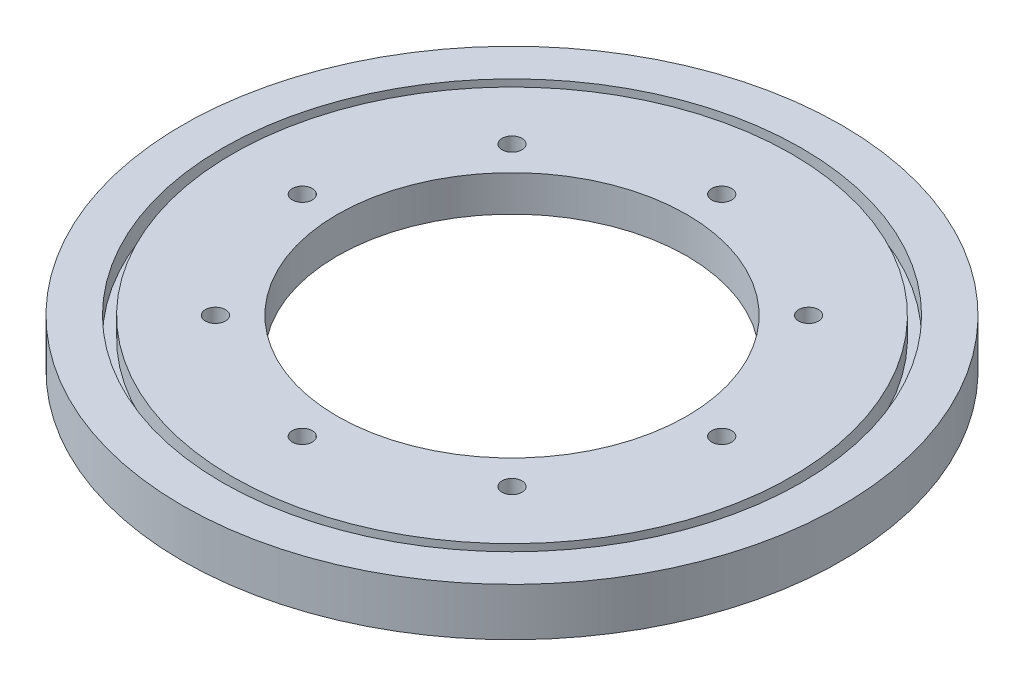
ISO-10303-21;
HEADER;
FILE_DESCRIPTION(('STEP AP214'),'2;1');
FILE_NAME('part.step','',(''),(''),'','','');
FILE_SCHEMA(('AUTOMOTIVE_DESIGN { 1 0 10303 214 1 1 1 1 }'));
ENDSEC;
DATA;
#1=APPLICATION_CONTEXT('core data for automotive mechanical design processes');
#2=APPLICATION_PROTOCOL_DEFINITION('international standard','automotive_design',2000,#1);
#3=PRODUCT_CONTEXT('',#1,'mechanical');
#4=PRODUCT('Part','Part','',(#3));
#5=PRODUCT_RELATED_PRODUCT_CATEGORY('part','',(#4));
#6=PRODUCT_DEFINITION_FORMATION('','',#4);
#7=PRODUCT_DEFINITION_CONTEXT('part definition',#1,'design');
#8=PRODUCT_DEFINITION('design','',#6,#7);
#9=PRODUCT_DEFINITION_SHAPE('','',#8);
#10=(LENGTH_UNIT() NAMED_UNIT(*) SI_UNIT(.MILLI.,.METRE.));
#11=(NAMED_UNIT(*) PLANE_ANGLE_UNIT() SI_UNIT($,.RADIAN.));
#12=(NAMED_UNIT(*) SI_UNIT($,.STERADIAN.) SOLID_ANGLE_UNIT());
#13=UNCERTAINTY_MEASURE_WITH_UNIT(LENGTH_MEASURE(1.E-05),#10,'distance_accuracy_value','');
#14=(GEOMETRIC_REPRESENTATION_CONTEXT(3) GLOBAL_UNCERTAINTY_ASSIGNED_CONTEXT((#13)) GLOBAL_UNIT_ASSIGNED_CONTEXT((#10,
#11,#12)) REPRESENTATION_CONTEXT('',''));
#15=CARTESIAN_POINT('',(0.,0.,0.));
#16=DIRECTION('',(0.,0.,1.));
#17=DIRECTION('',(1.,0.,0.));
#18=AXIS2_PLACEMENT_3D('',#15,#16,#17);
#19=CARTESIAN_POINT('',(0.,0.,0.));
#20=DIRECTION('',(0.,1.,0.));
#21=DIRECTION('',(0.,0.,1.));
#22=AXIS2_PLACEMENT_3D('',#19,#20,#21);
#23=CYLINDRICAL_SURFACE('',#22,87.5);
#24=CARTESIAN_POINT('',(0.,24.,0.));
#25=DIRECTION('',(0.,1.,0.));
#26=DIRECTION('',(0.,0.,1.));
#27=AXIS2_PLACEMENT_3D('',#24,#25,#26);
#28=CIRCLE('',#27,87.5);
#29=CARTESIAN_POINT('',(0.,24.,87.5));
#30=VERTEX_POINT('',#29);
#31=EDGE_CURVE('E57',#30,#30,#28,.T.);
#32=ORIENTED_EDGE('',*,*,#31,.T.);
#33=EDGE_LOOP('',(#32));
#34=FACE_BOUND('',#33,.T.);
#35=CARTESIAN_POINT('',(0.,6.,0.));
#36=DIRECTION('',(0.,-1.,0.));
#37=DIRECTION('',(0.,0.,-1.));
#38=AXIS2_PLACEMENT_3D('',#35,#36,#37);
#39=CIRCLE('',#38,87.5);
#40=CARTESIAN_POINT('',(0.,6.,-87.5));
#41=VERTEX_POINT('',#40);
#42=EDGE_CURVE('E46',#41,#41,#39,.F.);
#43=ORIENTED_EDGE('',*,*,#42,.F.);
#44=EDGE_LOOP('',(#43));
#45=FACE_BOUND('',#44,.T.);
#46=ADVANCED_FACE('F42',(#34,#45),#23,.F.);
#47=CARTESIAN_POINT('',(0.,24.,0.));
#48=DIRECTION('',(0.,1.,0.));
#49=DIRECTION('',(0.,0.,1.));
#50=AXIS2_PLACEMENT_3D('',#47,#48,#49);
#51=PLANE('',#50);
#52=CARTESIAN_POINT('',(0.,24.,105.));
#53=DIRECTION('',(0.,-1.,0.));
#54=DIRECTION('',(0.,0.,-1.));
#55=AXIS2_PLACEMENT_3D('',#52,#53,#54);
#56=CIRCLE('',#55,5.);
#57=CARTESIAN_POINT('',(0.,24.,100.));
#58=VERTEX_POINT('',#57);
#59=EDGE_CURVE('E83',#58,#58,#56,.T.);
#60=ORIENTED_EDGE('',*,*,#59,.T.);
#61=EDGE_LOOP('',(#60));
#62=FACE_BOUND('',#61,.T.);
#63=CARTESIAN_POINT('',(74.2462120245876,24.,74.2462120245874));
#64=DIRECTION('',(0.,-1.,0.));
#65=DIRECTION('',(0.,0.,-1.));
#66=AXIS2_PLACEMENT_3D('',#63,#64,#65);
#67=CIRCLE('',#66,5.00000000000001);
#68=CARTESIAN_POINT('',(74.2462120245876,24.,69.2462120245874));
#69=VERTEX_POINT('',#68);
#70=EDGE_CURVE('E135',#69,#69,#67,.T.);
#71=ORIENTED_EDGE('',*,*,#70,.T.);
#72=EDGE_LOOP('',(#71));
#73=FACE_BOUND('',#72,.T.);
#74=CARTESIAN_POINT('',(105.,24.,-3.66605540578529E-13));
#75=DIRECTION('',(0.,-1.,0.));
#76=DIRECTION('',(0.,0.,-1.));
#77=AXIS2_PLACEMENT_3D('',#74,#75,#76);
#78=CIRCLE('',#77,5.);
#79=CARTESIAN_POINT('',(105.,24.,-5.00000000000037));
#80=VERTEX_POINT('',#79);
#81=EDGE_CURVE('E127',#80,#80,#78,.T.);
#82=ORIENTED_EDGE('',*,*,#81,.T.);
#83=EDGE_LOOP('',(#82));
#84=FACE_BOUND('',#83,.T.);
#85=CARTESIAN_POINT('',(74.2462120245871,24.,-74.2462120245879));
#86=DIRECTION('',(0.,-1.,0.));
#87=DIRECTION('',(0.,0.,-1.));
#88=AXIS2_PLACEMENT_3D('',#85,#86,#87);
#89=CIRCLE('',#88,5.00000000000001);
#90=CARTESIAN_POINT('',(74.2462120245871,24.,-79.2462120245879));
#91=VERTEX_POINT('',#90);
#92=EDGE_CURVE('E119',#91,#91,#89,.T.);
#93=ORIENTED_EDGE('',*,*,#92,.T.);
#94=EDGE_LOOP('',(#93));
#95=FACE_BOUND('',#94,.T.);
#96=CARTESIAN_POINT('',(-7.33211081157058E-13,24.,-105.));
#97=DIRECTION('',(0.,-1.,0.));
#98=DIRECTION('',(0.,0.,-1.));
#99=AXIS2_PLACEMENT_3D('',#96,#97,#98);
#100=CIRCLE('',#99,5.);
#101=CARTESIAN_POINT('',(-7.33211081157058E-13,24.,-110.));
#102=VERTEX_POINT('',#101);
#103=EDGE_CURVE('E111',#102,#102,#100,.T.);
#104=ORIENTED_EDGE('',*,*,#103,.T.);
#105=EDGE_LOOP('',(#104));
#106=FACE_BOUND('',#105,.T.);
#107=CARTESIAN_POINT('',(-74.2462120245881,24.,-74.2462120245868));
#108=DIRECTION('',(0.,-1.,0.));
#109=DIRECTION('',(0.,0.,-1.));
#110=AXIS2_PLACEMENT_3D('',#107,#108,#109);
#111=CIRCLE('',#110,5.00000000000001);
#112=CARTESIAN_POINT('',(-74.2462120245881,24.,-79.2462120245868));
#113=VERTEX_POINT('',#112);
#114=EDGE_CURVE('E103',#113,#113,#111,.T.);
#115=ORIENTED_EDGE('',*,*,#114,.T.);
#116=EDGE_LOOP('',(#115));
#117=FACE_BOUND('',#116,.T.);
#118=CARTESIAN_POINT('',(-105.,24.,1.09981662173559E-12));
#119=DIRECTION('',(0.,-1.,0.));
#120=DIRECTION('',(0.,0.,-1.));
#121=AXIS2_PLACEMENT_3D('',#118,#119,#120);
#122=CIRCLE('',#121,5.);
#123=CARTESIAN_POINT('',(-105.,24.,-4.9999999999989));
#124=VERTEX_POINT('',#123);
#125=EDGE_CURVE('E95',#124,#124,#122,.T.);
#126=ORIENTED_EDGE('',*,*,#125,.T.);
#127=EDGE_LOOP('',(#126));
#128=FACE_BOUND('',#127,.T.);
#129=CARTESIAN_POINT('',(-74.2462120245866,24.,74.2462120245884));
#130=DIRECTION('',(0.,-1.,0.));
#131=DIRECTION('',(0.,0.,-1.));
#132=AXIS2_PLACEMENT_3D('',#129,#130,#131);
#133=CIRCLE('',#132,5.);
#134=CARTESIAN_POINT('',(-74.2462120245866,24.,69.2462120245884));
#135=VERTEX_POINT('',#134);
#136=EDGE_CURVE('E87',#135,#135,#133,.T.);
#137=ORIENTED_EDGE('',*,*,#136,.T.);
#138=EDGE_LOOP('',(#137));
#139=FACE_BOUND('',#138,.T.);
#140=ORIENTED_EDGE('',*,*,#31,.F.);
#141=EDGE_LOOP('',(#140));
#142=FACE_BOUND('',#141,.T.);
#143=CARTESIAN_POINT('',(0.,24.,0.));
#144=DIRECTION('',(0.,1.,0.));
#145=DIRECTION('',(0.,0.,1.));
#146=AXIS2_PLACEMENT_3D('',#143,#144,#145);
#147=CIRCLE('',#146,140.);
#148=CARTESIAN_POINT('',(0.,24.,140.));
#149=VERTEX_POINT('',#148);
#150=EDGE_CURVE('E71',#149,#149,#147,.T.);
#151=ORIENTED_EDGE('',*,*,#150,.T.);
#152=EDGE_LOOP('',(#151));
#153=FACE_BOUND('',#152,.T.);
#154=ADVANCED_FACE('F151',(#62,#73,#84,#95,#106,#117,#128,#139,#142,#153),#51,.T.);
#155=CARTESIAN_POINT('',(0.,24.,0.));
#156=DIRECTION('',(0.,-1.,0.));
#157=DIRECTION('',(0.,0.,-1.));
#158=AXIS2_PLACEMENT_3D('',#155,#156,#157);
#159=CYLINDRICAL_SURFACE('',#158,165.);
#160=CARTESIAN_POINT('',(0.,24.,0.));
#161=DIRECTION('',(0.,1.,0.));
#162=DIRECTION('',(0.,0.,1.));
#163=AXIS2_PLACEMENT_3D('',#160,#161,#162);
#164=CIRCLE('',#163,165.);
#165=CARTESIAN_POINT('',(0.,24.,165.));
#166=VERTEX_POINT('',#165);
#167=EDGE_CURVE('E10',#166,#166,#164,.T.);
#168=ORIENTED_EDGE('',*,*,#167,.F.);
#169=EDGE_LOOP('',(#168));
#170=FACE_BOUND('',#169,.T.);
#171=CARTESIAN_POINT('',(0.,0.,0.));
#172=DIRECTION('',(0.,1.,0.));
#173=DIRECTION('',(0.,0.,1.));
#174=AXIS2_PLACEMENT_3D('',#171,#172,#173);
#175=CIRCLE('',#174,165.);
#176=CARTESIAN_POINT('',(0.,0.,165.));
#177=VERTEX_POINT('',#176);
#178=EDGE_CURVE('E51',#177,#177,#175,.T.);
#179=ORIENTED_EDGE('',*,*,#178,.T.);
#180=EDGE_LOOP('',(#179));
#181=FACE_BOUND('',#180,.T.);
#182=ADVANCED_FACE('F44',(#170,#181),#159,.T.);
#183=CARTESIAN_POINT('',(0.,24.,0.));
#184=DIRECTION('',(0.,1.,0.));
#185=DIRECTION('',(0.,0.,1.));
#186=AXIS2_PLACEMENT_3D('',#183,#184,#185);
#187=CIRCLE('',#186,145.);
#188=CARTESIAN_POINT('',(0.,24.,145.));
#189=VERTEX_POINT('',#188);
#190=EDGE_CURVE('E63',#189,#189,#187,.T.);
#191=ORIENTED_EDGE('',*,*,#190,.F.);
#192=EDGE_LOOP('',(#191));
#193=FACE_BOUND('',#192,.T.);
#194=ORIENTED_EDGE('',*,*,#167,.T.);
#195=EDGE_LOOP('',(#194));
#196=FACE_BOUND('',#195,.T.);
#197=ADVANCED_FACE('F196',(#193,#196),#51,.T.);
#198=CARTESIAN_POINT('',(0.,0.,0.));
#199=DIRECTION('',(0.,1.,0.));
#200=DIRECTION('',(0.,0.,1.));
#201=AXIS2_PLACEMENT_3D('',#198,#199,#200);
#202=PLANE('',#201);
#203=CARTESIAN_POINT('',(0.,0.,0.));
#204=DIRECTION('',(0.,-1.,0.));
#205=DIRECTION('',(0.,0.,-1.));
#206=AXIS2_PLACEMENT_3D('',#203,#204,#205);
#207=CIRCLE('',#206,125.);
#208=CARTESIAN_POINT('',(0.,0.,-125.));
#209=VERTEX_POINT('',#208);
#210=EDGE_CURVE('E78',#209,#209,#207,.T.);
#211=ORIENTED_EDGE('',*,*,#210,.F.);
#212=EDGE_LOOP('',(#211));
#213=FACE_BOUND('',#212,.T.);
#214=ORIENTED_EDGE('',*,*,#178,.F.);
#215=EDGE_LOOP('',(#214));
#216=FACE_BOUND('',#215,.T.);
#217=ADVANCED_FACE('F201',(#213,#216),#202,.F.);
#218=CARTESIAN_POINT('',(0.,14.,0.));
#219=DIRECTION('',(0.,1.,0.));
#220=DIRECTION('',(0.,0.,1.));
#221=AXIS2_PLACEMENT_3D('',#218,#219,#220);
#222=CYLINDRICAL_SURFACE('',#221,145.);
#223=CARTESIAN_POINT('',(0.,14.,0.));
#224=DIRECTION('',(0.,1.,0.));
#225=DIRECTION('',(0.,0.,1.));
#226=AXIS2_PLACEMENT_3D('',#223,#224,#225);
#227=CIRCLE('',#226,145.);
#228=CARTESIAN_POINT('',(0.,14.,145.));
#229=VERTEX_POINT('',#228);
#230=EDGE_CURVE('E62',#229,#229,#227,.T.);
#231=ORIENTED_EDGE('',*,*,#230,.F.);
#232=EDGE_LOOP('',(#231));
#233=FACE_BOUND('',#232,.T.);
#234=ORIENTED_EDGE('',*,*,#190,.T.);
#235=EDGE_LOOP('',(#234));
#236=FACE_BOUND('',#235,.T.);
#237=ADVANCED_FACE('F198',(#233,#236),#222,.F.);
#238=CARTESIAN_POINT('',(0.,14.,0.));
#239=DIRECTION('',(0.,1.,0.));
#240=DIRECTION('',(0.,0.,1.));
#241=AXIS2_PLACEMENT_3D('',#238,#239,#240);
#242=PLANE('',#241);
#243=CARTESIAN_POINT('',(0.,14.,0.));
#244=DIRECTION('',(0.,1.,0.));
#245=DIRECTION('',(0.,0.,1.));
#246=AXIS2_PLACEMENT_3D('',#243,#244,#245);
#247=CIRCLE('',#246,140.);
#248=CARTESIAN_POINT('',(0.,14.,140.));
#249=VERTEX_POINT('',#248);
#250=EDGE_CURVE('E67',#249,#249,#247,.T.);
#251=ORIENTED_EDGE('',*,*,#250,.F.);
#252=EDGE_LOOP('',(#251));
#253=FACE_BOUND('',#252,.T.);
#254=ORIENTED_EDGE('',*,*,#230,.T.);
#255=EDGE_LOOP('',(#254));
#256=FACE_BOUND('',#255,.T.);
#257=ADVANCED_FACE('F208',(#253,#256),#242,.T.);
#258=CARTESIAN_POINT('',(0.,14.,0.));
#259=DIRECTION('',(0.,1.,0.));
#260=DIRECTION('',(0.,0.,1.));
#261=AXIS2_PLACEMENT_3D('',#258,#259,#260);
#262=CYLINDRICAL_SURFACE('',#261,140.);
#263=ORIENTED_EDGE('',*,*,#250,.T.);
#264=EDGE_LOOP('',(#263));
#265=FACE_BOUND('',#264,.T.);
#266=ORIENTED_EDGE('',*,*,#150,.F.);
#267=EDGE_LOOP('',(#266));
#268=FACE_BOUND('',#267,.T.);
#269=ADVANCED_FACE('F165',(#265,#268),#262,.T.);
#270=CARTESIAN_POINT('',(0.,6.,0.));
#271=DIRECTION('',(0.,-1.,0.));
#272=DIRECTION('',(0.,0.,-1.));
#273=AXIS2_PLACEMENT_3D('',#270,#271,#272);
#274=PLANE('',#273);
#275=CARTESIAN_POINT('',(0.,6.,105.));
#276=DIRECTION('',(0.,-1.,0.));
#277=DIRECTION('',(0.,0.,-1.));
#278=AXIS2_PLACEMENT_3D('',#275,#276,#277);
#279=CIRCLE('',#278,5.);
#280=CARTESIAN_POINT('',(0.,6.,100.));
#281=VERTEX_POINT('',#280);
#282=EDGE_CURVE('E143',#281,#281,#279,.T.);
#283=ORIENTED_EDGE('',*,*,#282,.F.);
#284=EDGE_LOOP('',(#283));
#285=FACE_BOUND('',#284,.T.);
#286=CARTESIAN_POINT('',(74.2462120245876,6.,74.2462120245874));
#287=DIRECTION('',(0.,-1.,0.));
#288=DIRECTION('',(0.,0.,-1.));
#289=AXIS2_PLACEMENT_3D('',#286,#287,#288);
#290=CIRCLE('',#289,5.00000000000001);
#291=CARTESIAN_POINT('',(74.2462120245876,6.,69.2462120245874));
#292=VERTEX_POINT('',#291);
#293=EDGE_CURVE('E139',#292,#292,#290,.T.);
#294=ORIENTED_EDGE('',*,*,#293,.F.);
#295=EDGE_LOOP('',(#294));
#296=FACE_BOUND('',#295,.T.);
#297=CARTESIAN_POINT('',(105.,6.,-3.66605540578529E-13));
#298=DIRECTION('',(0.,-1.,0.));
#299=DIRECTION('',(0.,0.,-1.));
#300=AXIS2_PLACEMENT_3D('',#297,#298,#299);
#301=CIRCLE('',#300,5.);
#302=CARTESIAN_POINT('',(105.,6.,-5.00000000000037));
#303=VERTEX_POINT('',#302);
#304=EDGE_CURVE('E131',#303,#303,#301,.T.);
#305=ORIENTED_EDGE('',*,*,#304,.F.);
#306=EDGE_LOOP('',(#305));
#307=FACE_BOUND('',#306,.T.);
#308=CARTESIAN_POINT('',(74.2462120245871,6.,-74.2462120245879));
#309=DIRECTION('',(0.,-1.,0.));
#310=DIRECTION('',(0.,0.,-1.));
#311=AXIS2_PLACEMENT_3D('',#308,#309,#310);
#312=CIRCLE('',#311,5.00000000000001);
#313=CARTESIAN_POINT('',(74.2462120245871,6.,-79.2462120245879));
#314=VERTEX_POINT('',#313);
#315=EDGE_CURVE('E123',#314,#314,#312,.T.);
#316=ORIENTED_EDGE('',*,*,#315,.F.);
#317=EDGE_LOOP('',(#316));
#318=FACE_BOUND('',#317,.T.);
#319=CARTESIAN_POINT('',(-7.33211081157058E-13,6.,-105.));
#320=DIRECTION('',(0.,-1.,0.));
#321=DIRECTION('',(0.,0.,-1.));
#322=AXIS2_PLACEMENT_3D('',#319,#320,#321);
#323=CIRCLE('',#322,5.);
#324=CARTESIAN_POINT('',(-7.33211081157058E-13,6.,-110.));
#325=VERTEX_POINT('',#324);
#326=EDGE_CURVE('E115',#325,#325,#323,.T.);
#327=ORIENTED_EDGE('',*,*,#326,.F.);
#328=EDGE_LOOP('',(#327));
#329=FACE_BOUND('',#328,.T.);
#330=CARTESIAN_POINT('',(-74.2462120245881,6.,-74.2462120245868));
#331=DIRECTION('',(0.,-1.,0.));
#332=DIRECTION('',(0.,0.,-1.));
#333=AXIS2_PLACEMENT_3D('',#330,#331,#332);
#334=CIRCLE('',#333,5.00000000000001);
#335=CARTESIAN_POINT('',(-74.2462120245881,6.,-79.2462120245868));
#336=VERTEX_POINT('',#335);
#337=EDGE_CURVE('E107',#336,#336,#334,.T.);
#338=ORIENTED_EDGE('',*,*,#337,.F.);
#339=EDGE_LOOP('',(#338));
#340=FACE_BOUND('',#339,.T.);
#341=CARTESIAN_POINT('',(-105.,6.,1.09981662173559E-12));
#342=DIRECTION('',(0.,-1.,0.));
#343=DIRECTION('',(0.,0.,-1.));
#344=AXIS2_PLACEMENT_3D('',#341,#342,#343);
#345=CIRCLE('',#344,5.);
#346=CARTESIAN_POINT('',(-105.,6.,-4.9999999999989));
#347=VERTEX_POINT('',#346);
#348=EDGE_CURVE('E99',#347,#347,#345,.T.);
#349=ORIENTED_EDGE('',*,*,#348,.F.);
#350=EDGE_LOOP('',(#349));
#351=FACE_BOUND('',#350,.T.);
#352=CARTESIAN_POINT('',(-74.2462120245866,6.,74.2462120245884));
#353=DIRECTION('',(0.,-1.,0.));
#354=DIRECTION('',(0.,0.,-1.));
#355=AXIS2_PLACEMENT_3D('',#352,#353,#354);
#356=CIRCLE('',#355,5.);
#357=CARTESIAN_POINT('',(-74.2462120245866,6.,69.2462120245884));
#358=VERTEX_POINT('',#357);
#359=EDGE_CURVE('E91',#358,#358,#356,.T.);
#360=ORIENTED_EDGE('',*,*,#359,.F.);
#361=EDGE_LOOP('',(#360));
#362=FACE_BOUND('',#361,.T.);
#363=CARTESIAN_POINT('',(0.,6.,0.));
#364=DIRECTION('',(0.,-1.,0.));
#365=DIRECTION('',(0.,0.,-1.));
#366=AXIS2_PLACEMENT_3D('',#363,#364,#365);
#367=CIRCLE('',#366,125.);
#368=CARTESIAN_POINT('',(0.,6.,-125.));
#369=VERTEX_POINT('',#368);
#370=EDGE_CURVE('E82',#369,#369,#367,.T.);
#371=ORIENTED_EDGE('',*,*,#370,.T.);
#372=EDGE_LOOP('',(#371));
#373=FACE_BOUND('',#372,.T.);
#374=ORIENTED_EDGE('',*,*,#42,.T.);
#375=EDGE_LOOP('',(#374));
#376=FACE_BOUND('',#375,.T.);
#377=ADVANCED_FACE('F161',(#285,#296,#307,#318,#329,#340,#351,#362,#373,#376),#274,.T.);
#378=CARTESIAN_POINT('',(0.,6.,0.));
#379=DIRECTION('',(0.,-1.,0.));
#380=DIRECTION('',(0.,0.,-1.));
#381=AXIS2_PLACEMENT_3D('',#378,#379,#380);
#382=CYLINDRICAL_SURFACE('',#381,125.);
#383=ORIENTED_EDGE('',*,*,#370,.F.);
#384=EDGE_LOOP('',(#383));
#385=FACE_BOUND('',#384,.T.);
#386=ORIENTED_EDGE('',*,*,#210,.T.);
#387=EDGE_LOOP('',(#386));
#388=FACE_BOUND('',#387,.T.);
#389=ADVANCED_FACE('F164',(#385,#388),#382,.F.);
#390=CARTESIAN_POINT('',(-74.2462120245866,24.,74.2462120245884));
#391=DIRECTION('',(0.,-1.,0.));
#392=DIRECTION('',(0.,0.,-1.));
#393=AXIS2_PLACEMENT_3D('',#390,#391,#392);
#394=CYLINDRICAL_SURFACE('',#393,5.);
#395=ORIENTED_EDGE('',*,*,#136,.F.);
#396=EDGE_LOOP('',(#395));
#397=FACE_BOUND('',#396,.T.);
#398=ORIENTED_EDGE('',*,*,#359,.T.);
#399=EDGE_LOOP('',(#398));
#400=FACE_BOUND('',#399,.T.);
#401=ADVANCED_FACE('F263',(#397,#400),#394,.F.);
#402=CARTESIAN_POINT('',(-105.,24.,1.09981662173559E-12));
#403=DIRECTION('',(0.,-1.,0.));
#404=DIRECTION('',(0.,0.,-1.));
#405=AXIS2_PLACEMENT_3D('',#402,#403,#404);
#406=CYLINDRICAL_SURFACE('',#405,5.);
#407=ORIENTED_EDGE('',*,*,#125,.F.);
#408=EDGE_LOOP('',(#407));
#409=FACE_BOUND('',#408,.T.);
#410=ORIENTED_EDGE('',*,*,#348,.T.);
#411=EDGE_LOOP('',(#410));
#412=FACE_BOUND('',#411,.T.);
#413=ADVANCED_FACE('F272',(#409,#412),#406,.F.);
#414=CARTESIAN_POINT('',(-74.2462120245881,24.,-74.2462120245868));
#415=DIRECTION('',(0.,-1.,0.));
#416=DIRECTION('',(0.,0.,-1.));
#417=AXIS2_PLACEMENT_3D('',#414,#415,#416);
#418=CYLINDRICAL_SURFACE('',#417,5.00000000000001);
#419=ORIENTED_EDGE('',*,*,#114,.F.);
#420=EDGE_LOOP('',(#419));
#421=FACE_BOUND('',#420,.T.);
#422=ORIENTED_EDGE('',*,*,#337,.T.);
#423=EDGE_LOOP('',(#422));
#424=FACE_BOUND('',#423,.T.);
#425=ADVANCED_FACE('F282',(#421,#424),#418,.F.);
#426=CARTESIAN_POINT('',(-7.33211081157058E-13,24.,-105.));
#427=DIRECTION('',(0.,-1.,0.));
#428=DIRECTION('',(0.,0.,-1.));
#429=AXIS2_PLACEMENT_3D('',#426,#427,#428);
#430=CYLINDRICAL_SURFACE('',#429,5.);
#431=ORIENTED_EDGE('',*,*,#103,.F.);
#432=EDGE_LOOP('',(#431));
#433=FACE_BOUND('',#432,.T.);
#434=ORIENTED_EDGE('',*,*,#326,.T.);
#435=EDGE_LOOP('',(#434));
#436=FACE_BOUND('',#435,.T.);
#437=ADVANCED_FACE('F292',(#433,#436),#430,.F.);
#438=CARTESIAN_POINT('',(74.2462120245871,24.,-74.2462120245879));
#439=DIRECTION('',(0.,-1.,0.));
#440=DIRECTION('',(0.,0.,-1.));
#441=AXIS2_PLACEMENT_3D('',#438,#439,#440);
#442=CYLINDRICAL_SURFACE('',#441,5.00000000000001);
#443=ORIENTED_EDGE('',*,*,#92,.F.);
#444=EDGE_LOOP('',(#443));
#445=FACE_BOUND('',#444,.T.);
#446=ORIENTED_EDGE('',*,*,#315,.T.);
#447=EDGE_LOOP('',(#446));
#448=FACE_BOUND('',#447,.T.);
#449=ADVANCED_FACE('F302',(#445,#448),#442,.F.);
#450=CARTESIAN_POINT('',(105.,24.,-3.66605540578529E-13));
#451=DIRECTION('',(0.,-1.,0.));
#452=DIRECTION('',(0.,0.,-1.));
#453=AXIS2_PLACEMENT_3D('',#450,#451,#452);
#454=CYLINDRICAL_SURFACE('',#453,5.);
#455=ORIENTED_EDGE('',*,*,#81,.F.);
#456=EDGE_LOOP('',(#455));
#457=FACE_BOUND('',#456,.T.);
#458=ORIENTED_EDGE('',*,*,#304,.T.);
#459=EDGE_LOOP('',(#458));
#460=FACE_BOUND('',#459,.T.);
#461=ADVANCED_FACE('F312',(#457,#460),#454,.F.);
#462=CARTESIAN_POINT('',(74.2462120245876,24.,74.2462120245874));
#463=DIRECTION('',(0.,-1.,0.));
#464=DIRECTION('',(0.,0.,-1.));
#465=AXIS2_PLACEMENT_3D('',#462,#463,#464);
#466=CYLINDRICAL_SURFACE('',#465,5.00000000000001);
#467=ORIENTED_EDGE('',*,*,#70,.F.);
#468=EDGE_LOOP('',(#467));
#469=FACE_BOUND('',#468,.T.);
#470=ORIENTED_EDGE('',*,*,#293,.T.);
#471=EDGE_LOOP('',(#470));
#472=FACE_BOUND('',#471,.T.);
#473=ADVANCED_FACE('F157',(#469,#472),#466,.F.);
#474=CARTESIAN_POINT('',(0.,24.,105.));
#475=DIRECTION('',(0.,-1.,0.));
#476=DIRECTION('',(0.,0.,-1.));
#477=AXIS2_PLACEMENT_3D('',#474,#475,#476);
#478=CYLINDRICAL_SURFACE('',#477,5.);
#479=ORIENTED_EDGE('',*,*,#59,.F.);
#480=EDGE_LOOP('',(#479));
#481=FACE_BOUND('',#480,.T.);
#482=ORIENTED_EDGE('',*,*,#282,.T.);
#483=EDGE_LOOP('',(#482));
#484=FACE_BOUND('',#483,.T.);
#485=ADVANCED_FACE('F154',(#481,#484),#478,.F.);
#486=CLOSED_SHELL('',(#46,#154,#182,#197,#217,#237,#257,#269,#377,#389,#401,#413,#425,#437,#449,
#461,#473,#485));
#487=MANIFOLD_SOLID_BREP('B2',#486);
#488=ADVANCED_BREP_SHAPE_REPRESENTATION('',(#18,#487),#14);
#489=SHAPE_DEFINITION_REPRESENTATION(#9,#488);
ENDSEC;
END-ISO-10303-21;
